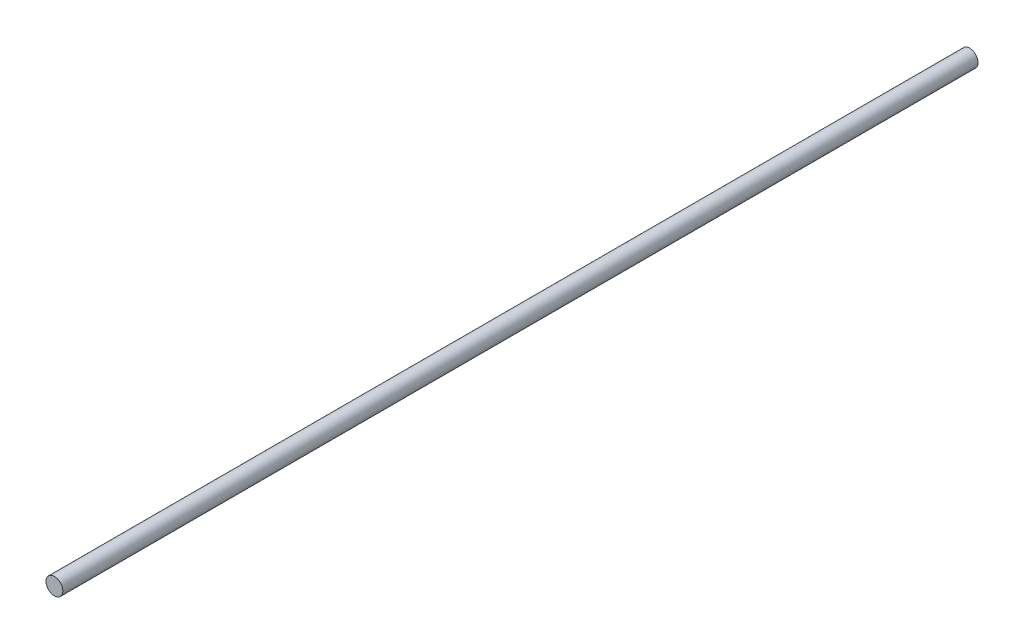
ISO-10303-21;
HEADER;
FILE_DESCRIPTION(('STEP AP214'),'2;1');
FILE_NAME('part.step','',(''),(''),'','','');
FILE_SCHEMA(('AUTOMOTIVE_DESIGN { 1 0 10303 214 1 1 1 1 }'));
ENDSEC;
DATA;
#1=APPLICATION_CONTEXT('core data for automotive mechanical design processes');
#2=APPLICATION_PROTOCOL_DEFINITION('international standard','automotive_design',2000,#1);
#3=PRODUCT_CONTEXT('',#1,'mechanical');
#4=PRODUCT('Part','Part','',(#3));
#5=PRODUCT_RELATED_PRODUCT_CATEGORY('part','',(#4));
#6=PRODUCT_DEFINITION_FORMATION('','',#4);
#7=PRODUCT_DEFINITION_CONTEXT('part definition',#1,'design');
#8=PRODUCT_DEFINITION('design','',#6,#7);
#9=PRODUCT_DEFINITION_SHAPE('','',#8);
#10=(LENGTH_UNIT() NAMED_UNIT(*) SI_UNIT(.MILLI.,.METRE.));
#11=(NAMED_UNIT(*) PLANE_ANGLE_UNIT() SI_UNIT($,.RADIAN.));
#12=(NAMED_UNIT(*) SI_UNIT($,.STERADIAN.) SOLID_ANGLE_UNIT());
#13=UNCERTAINTY_MEASURE_WITH_UNIT(LENGTH_MEASURE(1.E-05),#10,'distance_accuracy_value','');
#14=(GEOMETRIC_REPRESENTATION_CONTEXT(3) GLOBAL_UNCERTAINTY_ASSIGNED_CONTEXT((#13)) GLOBAL_UNIT_ASSIGNED_CONTEXT((#10,
#11,#12)) REPRESENTATION_CONTEXT('',''));
#15=CARTESIAN_POINT('',(0.,0.,0.));
#16=DIRECTION('',(0.,0.,1.));
#17=DIRECTION('',(1.,0.,0.));
#18=AXIS2_PLACEMENT_3D('',#15,#16,#17);
#19=CARTESIAN_POINT('',(0.,0.,435.));
#20=DIRECTION('',(0.,0.,-1.));
#21=DIRECTION('',(-1.,0.,0.));
#22=AXIS2_PLACEMENT_3D('',#19,#20,#21);
#23=CYLINDRICAL_SURFACE('',#22,4.);
#24=CARTESIAN_POINT('',(0.,0.,435.));
#25=DIRECTION('',(0.,0.,1.));
#26=DIRECTION('',(1.,0.,0.));
#27=AXIS2_PLACEMENT_3D('',#24,#25,#26);
#28=CIRCLE('',#27,4.);
#29=CARTESIAN_POINT('',(-4.,0.,435.));
#30=VERTEX_POINT('',#29);
#31=EDGE_CURVE('E10',#30,#30,#28,.T.);
#32=CARTESIAN_POINT('',(0.,0.,0.));
#33=DIRECTION('',(0.,0.,1.));
#34=DIRECTION('',(1.,0.,0.));
#35=AXIS2_PLACEMENT_3D('',#32,#33,#34);
#36=CIRCLE('',#35,4.);
#37=CARTESIAN_POINT('',(-4.,0.,0.));
#38=VERTEX_POINT('',#37);
#39=EDGE_CURVE('E34',#38,#38,#36,.T.);
#40=CARTESIAN_POINT('',(-4.,0.,435.));
#41=CARTESIAN_POINT('',(-4.,0.,430.46875));
#42=CARTESIAN_POINT('',(-4.,0.,425.9375));
#43=CARTESIAN_POINT('',(-4.,0.,416.875));
#44=CARTESIAN_POINT('',(-4.,0.,412.34375));
#45=CARTESIAN_POINT('',(-4.,0.,403.28125));
#46=CARTESIAN_POINT('',(-4.,0.,398.75));
#47=CARTESIAN_POINT('',(-4.,0.,389.6875));
#48=CARTESIAN_POINT('',(-4.,0.,385.15625));
#49=CARTESIAN_POINT('',(-4.,0.,376.09375));
#50=CARTESIAN_POINT('',(-4.,0.,371.5625));
#51=CARTESIAN_POINT('',(-4.,0.,362.5));
#52=CARTESIAN_POINT('',(-4.,0.,357.96875));
#53=CARTESIAN_POINT('',(-4.,0.,348.90625));
#54=CARTESIAN_POINT('',(-4.,0.,344.375));
#55=CARTESIAN_POINT('',(-4.,0.,335.3125));
#56=CARTESIAN_POINT('',(-4.,0.,330.78125));
#57=CARTESIAN_POINT('',(-4.,0.,321.71875));
#58=CARTESIAN_POINT('',(-4.,0.,317.1875));
#59=CARTESIAN_POINT('',(-4.,0.,308.125));
#60=CARTESIAN_POINT('',(-4.,0.,303.59375));
#61=CARTESIAN_POINT('',(-4.,0.,294.53125));
#62=CARTESIAN_POINT('',(-4.,0.,290.));
#63=CARTESIAN_POINT('',(-4.,0.,280.9375));
#64=CARTESIAN_POINT('',(-4.,0.,276.40625));
#65=CARTESIAN_POINT('',(-4.,0.,267.34375));
#66=CARTESIAN_POINT('',(-4.,0.,262.8125));
#67=CARTESIAN_POINT('',(-4.,0.,253.75));
#68=CARTESIAN_POINT('',(-4.,0.,249.21875));
#69=CARTESIAN_POINT('',(-4.,0.,240.15625));
#70=CARTESIAN_POINT('',(-4.,0.,235.625));
#71=CARTESIAN_POINT('',(-4.,0.,226.5625));
#72=CARTESIAN_POINT('',(-4.,0.,222.03125));
#73=CARTESIAN_POINT('',(-4.,0.,212.96875));
#74=CARTESIAN_POINT('',(-4.,0.,208.4375));
#75=CARTESIAN_POINT('',(-4.,0.,199.375));
#76=CARTESIAN_POINT('',(-4.,0.,194.84375));
#77=CARTESIAN_POINT('',(-4.,0.,185.78125));
#78=CARTESIAN_POINT('',(-4.,0.,181.25));
#79=CARTESIAN_POINT('',(-4.,0.,172.1875));
#80=CARTESIAN_POINT('',(-4.,0.,167.65625));
#81=CARTESIAN_POINT('',(-4.,0.,158.59375));
#82=CARTESIAN_POINT('',(-4.,0.,154.0625));
#83=CARTESIAN_POINT('',(-4.,0.,145.));
#84=CARTESIAN_POINT('',(-4.,0.,140.46875));
#85=CARTESIAN_POINT('',(-4.,0.,131.40625));
#86=CARTESIAN_POINT('',(-4.,0.,126.875));
#87=CARTESIAN_POINT('',(-4.,0.,117.8125));
#88=CARTESIAN_POINT('',(-4.,0.,113.28125));
#89=CARTESIAN_POINT('',(-4.,0.,104.21875));
#90=CARTESIAN_POINT('',(-4.,0.,99.6875));
#91=CARTESIAN_POINT('',(-4.,0.,90.625));
#92=CARTESIAN_POINT('',(-4.,0.,86.09375));
#93=CARTESIAN_POINT('',(-4.,0.,77.03125));
#94=CARTESIAN_POINT('',(-4.,0.,72.5));
#95=CARTESIAN_POINT('',(-4.,0.,63.4375));
#96=CARTESIAN_POINT('',(-4.,0.,58.90625));
#97=CARTESIAN_POINT('',(-4.,0.,49.84375));
#98=CARTESIAN_POINT('',(-4.,0.,45.3125));
#99=CARTESIAN_POINT('',(-4.,0.,36.25));
#100=CARTESIAN_POINT('',(-4.,0.,31.71875));
#101=CARTESIAN_POINT('',(-4.,0.,22.65625));
#102=CARTESIAN_POINT('',(-4.,0.,18.125));
#103=CARTESIAN_POINT('',(-4.,0.,9.06250000000001));
#104=CARTESIAN_POINT('',(-4.,0.,4.53125));
#105=CARTESIAN_POINT('',(-4.,0.,0.));
#106=B_SPLINE_CURVE_WITH_KNOTS('',3,(#40,#41,#42,#43,#44,#45,#46,#47,#48,#49,#50,#51,#52,#53,
#54,#55,#56,#57,#58,#59,#60,#61,#62,#63,#64,#65,#66,#67,#68,#69,#70,#71,#72,#73,#74,#75,#76,#77,
#78,#79,#80,#81,#82,#83,#84,#85,#86,#87,#88,#89,#90,#91,#92,#93,#94,#95,#96,#97,#98,#99,#100,
#101,#102,#103,#104,#105),.UNSPECIFIED.,.F.,.F.,(4,2,2,2,2,2,2,2,2,2,2,2,2,2,2,2,2,2,2,2,2,2,2,
2,2,2,2,2,2,2,2,2,4),(0.,13.59375,27.1875,40.78125,54.375,67.96875,81.5625,95.15625,108.75,
122.34375,135.9375,149.53125,163.125,176.71875,190.3125,203.90625,217.5,231.09375,244.6875,
258.28125,271.875,285.46875,299.0625,312.65625,326.25,339.84375,353.4375,367.03125,380.625,
394.21875,407.8125,421.40625,435.),.UNSPECIFIED.);
#107=EDGE_CURVE('BSEAM31',#30,#38,#106,.T.);
#108=ORIENTED_EDGE('',*,*,#31,.F.);
#109=ORIENTED_EDGE('',*,*,#39,.T.);
#110=ORIENTED_EDGE('',*,*,#107,.T.);
#111=ORIENTED_EDGE('',*,*,#107,.F.);
#112=EDGE_LOOP('',(#108,#110,#109,#111));
#113=FACE_BOUND('',#112,.T.);
#114=ADVANCED_FACE('F31',(#113),#23,.T.);
#115=CARTESIAN_POINT('',(0.,0.,435.));
#116=DIRECTION('',(0.,0.,1.));
#117=DIRECTION('',(1.,0.,0.));
#118=AXIS2_PLACEMENT_3D('',#115,#116,#117);
#119=PLANE('',#118);
#120=ORIENTED_EDGE('',*,*,#31,.T.);
#121=EDGE_LOOP('',(#120));
#122=FACE_BOUND('',#121,.T.);
#123=ADVANCED_FACE('F46',(#122),#119,.T.);
#124=CARTESIAN_POINT('',(0.,0.,0.));
#125=DIRECTION('',(0.,0.,1.));
#126=DIRECTION('',(1.,0.,0.));
#127=AXIS2_PLACEMENT_3D('',#124,#125,#126);
#128=PLANE('',#127);
#129=ORIENTED_EDGE('',*,*,#39,.F.);
#130=EDGE_LOOP('',(#129));
#131=FACE_BOUND('',#130,.T.);
#132=ADVANCED_FACE('F44',(#131),#128,.F.);
#133=CLOSED_SHELL('',(#114,#123,#132));
#134=MANIFOLD_SOLID_BREP('B2',#133);
#135=ADVANCED_BREP_SHAPE_REPRESENTATION('',(#18,#134),#14);
#136=SHAPE_DEFINITION_REPRESENTATION(#9,#135);
ENDSEC;
END-ISO-10303-21;
